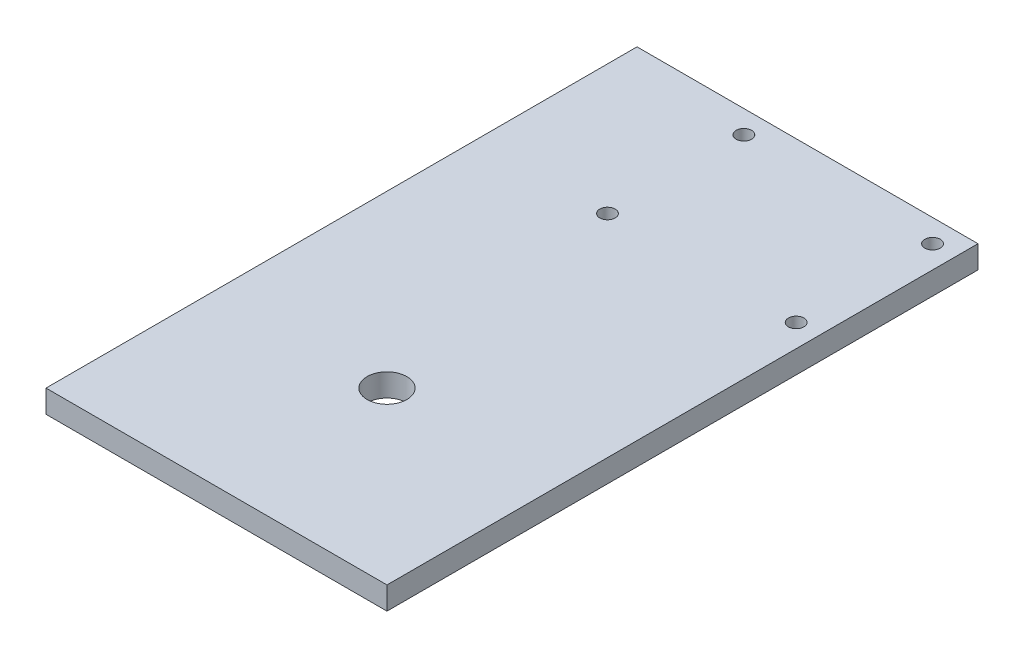
ISO-10303-21;
HEADER;
FILE_DESCRIPTION(('STEP AP214'),'2;1');
FILE_NAME('part.step','',(''),(''),'','','');
FILE_SCHEMA(('AUTOMOTIVE_DESIGN { 1 0 10303 214 1 1 1 1 }'));
ENDSEC;
DATA;
#1=APPLICATION_CONTEXT('core data for automotive mechanical design processes');
#2=APPLICATION_PROTOCOL_DEFINITION('international standard','automotive_design',2000,#1);
#3=PRODUCT_CONTEXT('',#1,'mechanical');
#4=PRODUCT('Part','Part','',(#3));
#5=PRODUCT_RELATED_PRODUCT_CATEGORY('part','',(#4));
#6=PRODUCT_DEFINITION_FORMATION('','',#4);
#7=PRODUCT_DEFINITION_CONTEXT('part definition',#1,'design');
#8=PRODUCT_DEFINITION('design','',#6,#7);
#9=PRODUCT_DEFINITION_SHAPE('','',#8);
#10=(LENGTH_UNIT() NAMED_UNIT(*) SI_UNIT(.MILLI.,.METRE.));
#11=(NAMED_UNIT(*) PLANE_ANGLE_UNIT() SI_UNIT($,.RADIAN.));
#12=(NAMED_UNIT(*) SI_UNIT($,.STERADIAN.) SOLID_ANGLE_UNIT());
#13=UNCERTAINTY_MEASURE_WITH_UNIT(LENGTH_MEASURE(1.E-05),#10,'distance_accuracy_value','');
#14=(GEOMETRIC_REPRESENTATION_CONTEXT(3) GLOBAL_UNCERTAINTY_ASSIGNED_CONTEXT((#13)) GLOBAL_UNIT_ASSIGNED_CONTEXT((#10,
#11,#12)) REPRESENTATION_CONTEXT('',''));
#15=CARTESIAN_POINT('',(0.,0.,0.));
#16=DIRECTION('',(0.,0.,1.));
#17=DIRECTION('',(1.,0.,0.));
#18=AXIS2_PLACEMENT_3D('',#15,#16,#17);
#19=CARTESIAN_POINT('',(0.,330.,0.));
#20=DIRECTION('',(0.,1.,0.));
#21=DIRECTION('',(0.,0.,1.));
#22=AXIS2_PLACEMENT_3D('',#19,#20,#21);
#23=PLANE('',#22);
#24=CARTESIAN_POINT('',(-560.,330.,1010.));
#25=DIRECTION('',(0.,-1.,0.));
#26=DIRECTION('',(0.,0.,-1.));
#27=AXIS2_PLACEMENT_3D('',#24,#25,#26);
#28=CIRCLE('',#27,3.39999999999991);
#29=CARTESIAN_POINT('',(-560.,330.,1006.6));
#30=VERTEX_POINT('',#29);
#31=EDGE_CURVE('E145',#30,#30,#28,.T.);
#32=ORIENTED_EDGE('',*,*,#31,.F.);
#33=EDGE_LOOP('',(#32));
#34=FACE_BOUND('',#33,.T.);
#35=CARTESIAN_POINT('',(-643.,330.,950.));
#36=DIRECTION('',(0.,-1.,0.));
#37=DIRECTION('',(0.,0.,-1.));
#38=AXIS2_PLACEMENT_3D('',#35,#36,#37);
#39=CIRCLE('',#38,3.39999999999991);
#40=CARTESIAN_POINT('',(-643.,330.,946.6));
#41=VERTEX_POINT('',#40);
#42=EDGE_CURVE('E138',#41,#41,#39,.T.);
#43=ORIENTED_EDGE('',*,*,#42,.F.);
#44=EDGE_LOOP('',(#43));
#45=FACE_BOUND('',#44,.T.);
#46=CARTESIAN_POINT('',(-560.,330.,950.));
#47=DIRECTION('',(0.,-1.,0.));
#48=DIRECTION('',(0.,0.,-1.));
#49=AXIS2_PLACEMENT_3D('',#46,#47,#48);
#50=CIRCLE('',#49,3.39999999999991);
#51=CARTESIAN_POINT('',(-560.,330.,946.6));
#52=VERTEX_POINT('',#51);
#53=EDGE_CURVE('E150',#52,#52,#50,.T.);
#54=ORIENTED_EDGE('',*,*,#53,.F.);
#55=EDGE_LOOP('',(#54));
#56=FACE_BOUND('',#55,.T.);
#57=CARTESIAN_POINT('',(-643.,330.,1010.));
#58=DIRECTION('',(0.,-1.,0.));
#59=DIRECTION('',(0.,0.,-1.));
#60=AXIS2_PLACEMENT_3D('',#57,#58,#59);
#61=CIRCLE('',#60,3.39999999999991);
#62=CARTESIAN_POINT('',(-643.,330.,1006.6));
#63=VERTEX_POINT('',#62);
#64=EDGE_CURVE('E131',#63,#63,#61,.T.);
#65=ORIENTED_EDGE('',*,*,#64,.F.);
#66=EDGE_LOOP('',(#65));
#67=FACE_BOUND('',#66,.T.);
#68=DIRECTION('',(1.,0.,0.));
#69=VECTOR('',#68,1.);
#70=CARTESIAN_POINT('',(-700.,330.,940.));
#71=LINE('',#70,#69);
#72=CARTESIAN_POINT('',(-700.,330.,940.));
#73=VERTEX_POINT('',#72);
#74=CARTESIAN_POINT('',(-550.,330.,940.));
#75=VERTEX_POINT('',#74);
#76=EDGE_CURVE('E116',#73,#75,#71,.T.);
#77=ORIENTED_EDGE('',*,*,#76,.T.);
#78=DIRECTION('',(0.,0.,1.));
#79=VECTOR('',#78,1.);
#80=CARTESIAN_POINT('',(-550.,330.,940.));
#81=LINE('',#80,#79);
#82=CARTESIAN_POINT('',(-550.,330.,1200.));
#83=VERTEX_POINT('',#82);
#84=EDGE_CURVE('E103',#75,#83,#81,.T.);
#85=ORIENTED_EDGE('',*,*,#84,.T.);
#86=DIRECTION('',(-1.,0.,0.));
#87=VECTOR('',#86,1.);
#88=CARTESIAN_POINT('',(-700.,330.,1200.));
#89=LINE('',#88,#87);
#90=CARTESIAN_POINT('',(-700.,330.,1200.));
#91=VERTEX_POINT('',#90);
#92=EDGE_CURVE('E87',#83,#91,#89,.T.);
#93=ORIENTED_EDGE('',*,*,#92,.T.);
#94=DIRECTION('',(0.,0.,1.));
#95=VECTOR('',#94,1.);
#96=CARTESIAN_POINT('',(-700.,330.,940.));
#97=LINE('',#96,#95);
#98=EDGE_CURVE('E92',#91,#73,#97,.F.);
#99=ORIENTED_EDGE('',*,*,#98,.T.);
#100=EDGE_LOOP('',(#77,#85,#93,#99));
#101=FACE_BOUND('',#100,.T.);
#102=CARTESIAN_POINT('',(-625.,330.,1125.));
#103=DIRECTION('',(0.,1.,0.));
#104=DIRECTION('',(0.,0.,1.));
#105=AXIS2_PLACEMENT_3D('',#102,#103,#104);
#106=CIRCLE('',#105,8.75000000000004);
#107=CARTESIAN_POINT('',(-625.,330.,1133.75));
#108=VERTEX_POINT('',#107);
#109=EDGE_CURVE('E45',#108,#108,#106,.T.);
#110=ORIENTED_EDGE('',*,*,#109,.T.);
#111=EDGE_LOOP('',(#110));
#112=FACE_BOUND('',#111,.T.);
#113=ADVANCED_FACE('F42',(#34,#45,#56,#67,#101,#112),#23,.F.);
#114=CARTESIAN_POINT('',(-625.,340.,1125.));
#115=DIRECTION('',(0.,1.,0.));
#116=DIRECTION('',(0.,0.,1.));
#117=AXIS2_PLACEMENT_3D('',#114,#115,#116);
#118=CYLINDRICAL_SURFACE('',#117,8.75000000000004);
#119=CARTESIAN_POINT('',(-625.,340.,1125.));
#120=DIRECTION('',(0.,1.,0.));
#121=DIRECTION('',(0.,0.,1.));
#122=AXIS2_PLACEMENT_3D('',#119,#120,#121);
#123=CIRCLE('',#122,8.75000000000004);
#124=CARTESIAN_POINT('',(-625.,340.,1133.75));
#125=VERTEX_POINT('',#124);
#126=EDGE_CURVE('E113',#125,#125,#123,.F.);
#127=ORIENTED_EDGE('',*,*,#126,.F.);
#128=EDGE_LOOP('',(#127));
#129=FACE_BOUND('',#128,.T.);
#130=ORIENTED_EDGE('',*,*,#109,.F.);
#131=EDGE_LOOP('',(#130));
#132=FACE_BOUND('',#131,.T.);
#133=ADVANCED_FACE('F168',(#129,#132),#118,.F.);
#134=CARTESIAN_POINT('',(-700.,340.,940.));
#135=DIRECTION('',(1.,0.,0.));
#136=DIRECTION('',(0.,1.,0.));
#137=AXIS2_PLACEMENT_3D('',#134,#135,#136);
#138=PLANE('',#137);
#139=DIRECTION('',(0.,1.,0.));
#140=VECTOR('',#139,1.);
#141=CARTESIAN_POINT('',(-700.,340.,1200.));
#142=LINE('',#141,#140);
#143=CARTESIAN_POINT('',(-700.,340.,1200.));
#144=VERTEX_POINT('',#143);
#145=EDGE_CURVE('E94',#91,#144,#142,.T.);
#146=ORIENTED_EDGE('',*,*,#145,.T.);
#147=DIRECTION('',(0.,0.,1.));
#148=VECTOR('',#147,1.);
#149=CARTESIAN_POINT('',(-700.,340.,0.));
#150=LINE('',#149,#148);
#151=CARTESIAN_POINT('',(-700.,340.,940.));
#152=VERTEX_POINT('',#151);
#153=EDGE_CURVE('E115',#152,#144,#150,.T.);
#154=ORIENTED_EDGE('',*,*,#153,.F.);
#155=DIRECTION('',(0.,1.,0.));
#156=VECTOR('',#155,1.);
#157=CARTESIAN_POINT('',(-700.,340.,940.));
#158=LINE('',#157,#156);
#159=EDGE_CURVE('E97',#152,#73,#158,.F.);
#160=ORIENTED_EDGE('',*,*,#159,.T.);
#161=ORIENTED_EDGE('',*,*,#98,.F.);
#162=EDGE_LOOP('',(#146,#154,#160,#161));
#163=FACE_BOUND('',#162,.T.);
#164=ADVANCED_FACE('F93',(#163),#138,.F.);
#165=CARTESIAN_POINT('',(-700.,340.,1200.));
#166=DIRECTION('',(0.,0.,-1.));
#167=DIRECTION('',(-1.,0.,0.));
#168=AXIS2_PLACEMENT_3D('',#165,#166,#167);
#169=PLANE('',#168);
#170=DIRECTION('',(0.,1.,0.));
#171=VECTOR('',#170,1.);
#172=CARTESIAN_POINT('',(-550.,340.,1200.));
#173=LINE('',#172,#171);
#174=CARTESIAN_POINT('',(-550.,340.,1200.));
#175=VERTEX_POINT('',#174);
#176=EDGE_CURVE('E105',#83,#175,#173,.T.);
#177=ORIENTED_EDGE('',*,*,#176,.T.);
#178=DIRECTION('',(1.,0.,0.));
#179=VECTOR('',#178,1.);
#180=CARTESIAN_POINT('',(0.,340.,1200.));
#181=LINE('',#180,#179);
#182=EDGE_CURVE('E109',#144,#175,#181,.T.);
#183=ORIENTED_EDGE('',*,*,#182,.F.);
#184=ORIENTED_EDGE('',*,*,#145,.F.);
#185=ORIENTED_EDGE('',*,*,#92,.F.);
#186=EDGE_LOOP('',(#177,#183,#184,#185));
#187=FACE_BOUND('',#186,.T.);
#188=ADVANCED_FACE('F107',(#187),#169,.F.);
#189=CARTESIAN_POINT('',(-550.,340.,940.));
#190=DIRECTION('',(-1.,0.,0.));
#191=DIRECTION('',(0.,0.,1.));
#192=AXIS2_PLACEMENT_3D('',#189,#190,#191);
#193=PLANE('',#192);
#194=DIRECTION('',(0.,1.,0.));
#195=VECTOR('',#194,1.);
#196=CARTESIAN_POINT('',(-550.,340.,940.));
#197=LINE('',#196,#195);
#198=CARTESIAN_POINT('',(-550.,340.,940.));
#199=VERTEX_POINT('',#198);
#200=EDGE_CURVE('E64',#75,#199,#197,.T.);
#201=ORIENTED_EDGE('',*,*,#200,.T.);
#202=DIRECTION('',(0.,0.,1.));
#203=VECTOR('',#202,1.);
#204=CARTESIAN_POINT('',(-550.,340.,0.));
#205=LINE('',#204,#203);
#206=EDGE_CURVE('E51',#175,#199,#205,.F.);
#207=ORIENTED_EDGE('',*,*,#206,.F.);
#208=ORIENTED_EDGE('',*,*,#176,.F.);
#209=ORIENTED_EDGE('',*,*,#84,.F.);
#210=EDGE_LOOP('',(#201,#207,#208,#209));
#211=FACE_BOUND('',#210,.T.);
#212=ADVANCED_FACE('F126',(#211),#193,.F.);
#213=CARTESIAN_POINT('',(-700.,340.,940.));
#214=DIRECTION('',(0.,0.,1.));
#215=DIRECTION('',(1.,0.,0.));
#216=AXIS2_PLACEMENT_3D('',#213,#214,#215);
#217=PLANE('',#216);
#218=ORIENTED_EDGE('',*,*,#159,.F.);
#219=DIRECTION('',(1.,0.,0.));
#220=VECTOR('',#219,1.);
#221=CARTESIAN_POINT('',(0.,340.,940.));
#222=LINE('',#221,#220);
#223=EDGE_CURVE('E11',#199,#152,#222,.F.);
#224=ORIENTED_EDGE('',*,*,#223,.F.);
#225=ORIENTED_EDGE('',*,*,#200,.F.);
#226=ORIENTED_EDGE('',*,*,#76,.F.);
#227=EDGE_LOOP('',(#218,#224,#225,#226));
#228=FACE_BOUND('',#227,.T.);
#229=ADVANCED_FACE('F178',(#228),#217,.F.);
#230=CARTESIAN_POINT('',(0.,340.,0.));
#231=DIRECTION('',(0.,1.,0.));
#232=DIRECTION('',(0.,0.,1.));
#233=AXIS2_PLACEMENT_3D('',#230,#231,#232);
#234=PLANE('',#233);
#235=CARTESIAN_POINT('',(-560.,340.,1010.));
#236=DIRECTION('',(0.,-1.,0.));
#237=DIRECTION('',(0.,0.,-1.));
#238=AXIS2_PLACEMENT_3D('',#235,#236,#237);
#239=CIRCLE('',#238,3.39999999999991);
#240=CARTESIAN_POINT('',(-560.,340.,1006.6));
#241=VERTEX_POINT('',#240);
#242=EDGE_CURVE('E135',#241,#241,#239,.T.);
#243=ORIENTED_EDGE('',*,*,#242,.T.);
#244=EDGE_LOOP('',(#243));
#245=FACE_BOUND('',#244,.T.);
#246=CARTESIAN_POINT('',(-643.,340.,950.));
#247=DIRECTION('',(0.,-1.,0.));
#248=DIRECTION('',(0.,0.,-1.));
#249=AXIS2_PLACEMENT_3D('',#246,#247,#248);
#250=CIRCLE('',#249,3.39999999999991);
#251=CARTESIAN_POINT('',(-643.,340.,946.6));
#252=VERTEX_POINT('',#251);
#253=EDGE_CURVE('E141',#252,#252,#250,.T.);
#254=ORIENTED_EDGE('',*,*,#253,.T.);
#255=EDGE_LOOP('',(#254));
#256=FACE_BOUND('',#255,.T.);
#257=CARTESIAN_POINT('',(-560.,340.,950.));
#258=DIRECTION('',(0.,-1.,0.));
#259=DIRECTION('',(0.,0.,-1.));
#260=AXIS2_PLACEMENT_3D('',#257,#258,#259);
#261=CIRCLE('',#260,3.39999999999991);
#262=CARTESIAN_POINT('',(-560.,340.,946.6));
#263=VERTEX_POINT('',#262);
#264=EDGE_CURVE('E142',#263,#263,#261,.T.);
#265=ORIENTED_EDGE('',*,*,#264,.T.);
#266=EDGE_LOOP('',(#265));
#267=FACE_BOUND('',#266,.T.);
#268=CARTESIAN_POINT('',(-643.,340.,1010.));
#269=DIRECTION('',(0.,-1.,0.));
#270=DIRECTION('',(0.,0.,-1.));
#271=AXIS2_PLACEMENT_3D('',#268,#269,#270);
#272=CIRCLE('',#271,3.39999999999991);
#273=CARTESIAN_POINT('',(-643.,340.,1006.6));
#274=VERTEX_POINT('',#273);
#275=EDGE_CURVE('E134',#274,#274,#272,.T.);
#276=ORIENTED_EDGE('',*,*,#275,.T.);
#277=EDGE_LOOP('',(#276));
#278=FACE_BOUND('',#277,.T.);
#279=ORIENTED_EDGE('',*,*,#206,.T.);
#280=ORIENTED_EDGE('',*,*,#223,.T.);
#281=ORIENTED_EDGE('',*,*,#153,.T.);
#282=ORIENTED_EDGE('',*,*,#182,.T.);
#283=EDGE_LOOP('',(#279,#280,#281,#282));
#284=FACE_BOUND('',#283,.T.);
#285=ORIENTED_EDGE('',*,*,#126,.T.);
#286=EDGE_LOOP('',(#285));
#287=FACE_BOUND('',#286,.T.);
#288=ADVANCED_FACE('F129',(#245,#256,#267,#278,#284,#287),#234,.T.);
#289=CARTESIAN_POINT('',(-643.,340.,1010.));
#290=DIRECTION('',(0.,-1.,0.));
#291=DIRECTION('',(0.,0.,-1.));
#292=AXIS2_PLACEMENT_3D('',#289,#290,#291);
#293=CYLINDRICAL_SURFACE('',#292,3.39999999999991);
#294=ORIENTED_EDGE('',*,*,#275,.F.);
#295=EDGE_LOOP('',(#294));
#296=FACE_BOUND('',#295,.T.);
#297=ORIENTED_EDGE('',*,*,#64,.T.);
#298=EDGE_LOOP('',(#297));
#299=FACE_BOUND('',#298,.T.);
#300=ADVANCED_FACE('F162',(#296,#299),#293,.F.);
#301=CARTESIAN_POINT('',(-560.,340.,950.));
#302=DIRECTION('',(0.,-1.,0.));
#303=DIRECTION('',(0.,0.,-1.));
#304=AXIS2_PLACEMENT_3D('',#301,#302,#303);
#305=CYLINDRICAL_SURFACE('',#304,3.39999999999991);
#306=ORIENTED_EDGE('',*,*,#264,.F.);
#307=EDGE_LOOP('',(#306));
#308=FACE_BOUND('',#307,.T.);
#309=ORIENTED_EDGE('',*,*,#53,.T.);
#310=EDGE_LOOP('',(#309));
#311=FACE_BOUND('',#310,.T.);
#312=ADVANCED_FACE('F158',(#308,#311),#305,.F.);
#313=CARTESIAN_POINT('',(-643.,340.,950.));
#314=DIRECTION('',(0.,-1.,0.));
#315=DIRECTION('',(0.,0.,-1.));
#316=AXIS2_PLACEMENT_3D('',#313,#314,#315);
#317=CYLINDRICAL_SURFACE('',#316,3.39999999999991);
#318=ORIENTED_EDGE('',*,*,#253,.F.);
#319=EDGE_LOOP('',(#318));
#320=FACE_BOUND('',#319,.T.);
#321=ORIENTED_EDGE('',*,*,#42,.T.);
#322=EDGE_LOOP('',(#321));
#323=FACE_BOUND('',#322,.T.);
#324=ADVANCED_FACE('F161',(#320,#323),#317,.F.);
#325=CARTESIAN_POINT('',(-560.,340.,1010.));
#326=DIRECTION('',(0.,-1.,0.));
#327=DIRECTION('',(0.,0.,-1.));
#328=AXIS2_PLACEMENT_3D('',#325,#326,#327);
#329=CYLINDRICAL_SURFACE('',#328,3.39999999999991);
#330=ORIENTED_EDGE('',*,*,#242,.F.);
#331=EDGE_LOOP('',(#330));
#332=FACE_BOUND('',#331,.T.);
#333=ORIENTED_EDGE('',*,*,#31,.T.);
#334=EDGE_LOOP('',(#333));
#335=FACE_BOUND('',#334,.T.);
#336=ADVANCED_FACE('F251',(#332,#335),#329,.F.);
#337=CLOSED_SHELL('',(#113,#133,#164,#188,#212,#229,#288,#300,#312,#324,#336));
#338=MANIFOLD_SOLID_BREP('B2',#337);
#339=ADVANCED_BREP_SHAPE_REPRESENTATION('',(#18,#338),#14);
#340=SHAPE_DEFINITION_REPRESENTATION(#9,#339);
ENDSEC;
END-ISO-10303-21;
